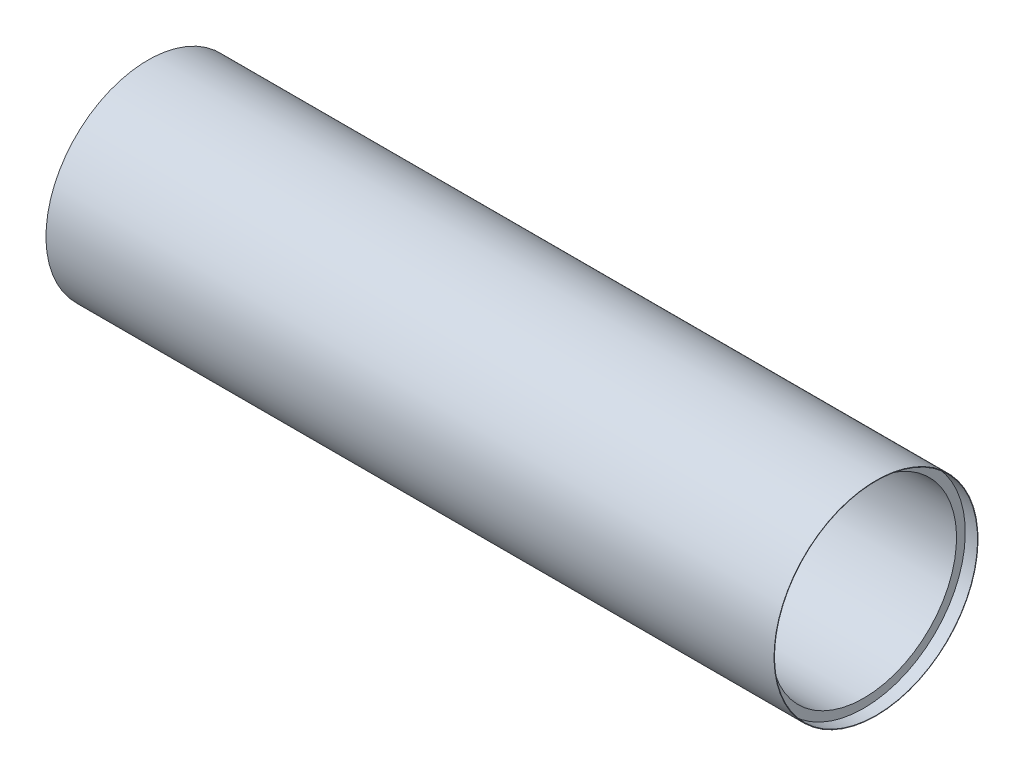
ISO-10303-21;
HEADER;
FILE_DESCRIPTION(('STEP AP214'),'2;1');
FILE_NAME('part.step','',(''),(''),'','','');
FILE_SCHEMA(('AUTOMOTIVE_DESIGN { 1 0 10303 214 1 1 1 1 }'));
ENDSEC;
DATA;
#1=APPLICATION_CONTEXT('core data for automotive mechanical design processes');
#2=APPLICATION_PROTOCOL_DEFINITION('international standard','automotive_design',2000,#1);
#3=PRODUCT_CONTEXT('',#1,'mechanical');
#4=PRODUCT('Part','Part','',(#3));
#5=PRODUCT_RELATED_PRODUCT_CATEGORY('part','',(#4));
#6=PRODUCT_DEFINITION_FORMATION('','',#4);
#7=PRODUCT_DEFINITION_CONTEXT('part definition',#1,'design');
#8=PRODUCT_DEFINITION('design','',#6,#7);
#9=PRODUCT_DEFINITION_SHAPE('','',#8);
#10=(LENGTH_UNIT() NAMED_UNIT(*) SI_UNIT(.MILLI.,.METRE.));
#11=(NAMED_UNIT(*) PLANE_ANGLE_UNIT() SI_UNIT($,.RADIAN.));
#12=(NAMED_UNIT(*) SI_UNIT($,.STERADIAN.) SOLID_ANGLE_UNIT());
#13=UNCERTAINTY_MEASURE_WITH_UNIT(LENGTH_MEASURE(1.E-05),#10,'distance_accuracy_value','');
#14=(GEOMETRIC_REPRESENTATION_CONTEXT(3) GLOBAL_UNCERTAINTY_ASSIGNED_CONTEXT((#13)) GLOBAL_UNIT_ASSIGNED_CONTEXT((#10,
#11,#12)) REPRESENTATION_CONTEXT('',''));
#15=CARTESIAN_POINT('',(0.,0.,0.));
#16=DIRECTION('',(0.,0.,1.));
#17=DIRECTION('',(1.,0.,0.));
#18=AXIS2_PLACEMENT_3D('',#15,#16,#17);
#19=CARTESIAN_POINT('',(0.,0.,0.));
#20=DIRECTION('',(-1.,0.,0.));
#21=DIRECTION('',(0.,-1.,0.));
#22=AXIS2_PLACEMENT_3D('',#19,#20,#21);
#23=CYLINDRICAL_SURFACE('',#22,84.3534);
#24=CARTESIAN_POINT('',(39.146309032124,0.,0.));
#25=DIRECTION('',(-1.,0.,0.));
#26=DIRECTION('',(0.,-1.,0.));
#27=AXIS2_PLACEMENT_3D('',#24,#25,#26);
#28=CIRCLE('',#27,84.3534);
#29=CARTESIAN_POINT('',(39.146309032124,-84.3534,0.));
#30=VERTEX_POINT('',#29);
#31=EDGE_CURVE('E10',#30,#30,#28,.T.);
#32=ORIENTED_EDGE('',*,*,#31,.F.);
#33=EDGE_LOOP('',(#32));
#34=FACE_BOUND('',#33,.T.);
#35=CARTESIAN_POINT('',(641.202509032124,0.,0.));
#36=DIRECTION('',(-1.,0.,0.));
#37=DIRECTION('',(0.,-1.,0.));
#38=AXIS2_PLACEMENT_3D('',#35,#36,#37);
#39=CIRCLE('',#38,84.3534);
#40=CARTESIAN_POINT('',(641.202509032124,-84.3534,0.));
#41=VERTEX_POINT('',#40);
#42=EDGE_CURVE('E60',#41,#41,#39,.T.);
#43=ORIENTED_EDGE('',*,*,#42,.T.);
#44=EDGE_LOOP('',(#43));
#45=FACE_BOUND('',#44,.T.);
#46=ADVANCED_FACE('F32',(#34,#45),#23,.T.);
#47=CARTESIAN_POINT('',(39.146309032124,0.,0.));
#48=DIRECTION('',(1.,0.,0.));
#49=DIRECTION('',(0.,1.,0.));
#50=AXIS2_PLACEMENT_3D('',#47,#48,#49);
#51=PLANE('',#50);
#52=CARTESIAN_POINT('',(39.146309032124,0.,0.));
#53=DIRECTION('',(-1.,0.,0.));
#54=DIRECTION('',(0.,-1.,0.));
#55=AXIS2_PLACEMENT_3D('',#52,#53,#54);
#56=CIRCLE('',#55,83.9724);
#57=CARTESIAN_POINT('',(39.146309032124,-83.9724,0.));
#58=VERTEX_POINT('',#57);
#59=EDGE_CURVE('E38',#58,#58,#56,.T.);
#60=ORIENTED_EDGE('',*,*,#59,.F.);
#61=EDGE_LOOP('',(#60));
#62=FACE_BOUND('',#61,.T.);
#63=ORIENTED_EDGE('',*,*,#31,.T.);
#64=EDGE_LOOP('',(#63));
#65=FACE_BOUND('',#64,.T.);
#66=ADVANCED_FACE('F97',(#62,#65),#51,.F.);
#67=CARTESIAN_POINT('',(0.,0.,0.));
#68=DIRECTION('',(-1.,0.,0.));
#69=DIRECTION('',(0.,-1.,0.));
#70=AXIS2_PLACEMENT_3D('',#67,#68,#69);
#71=CYLINDRICAL_SURFACE('',#70,83.9724);
#72=CARTESIAN_POINT('',(49.306309032124,0.,0.));
#73=DIRECTION('',(-1.,0.,0.));
#74=DIRECTION('',(0.,-1.,0.));
#75=AXIS2_PLACEMENT_3D('',#72,#73,#74);
#76=CIRCLE('',#75,83.9724);
#77=CARTESIAN_POINT('',(49.306309032124,-83.9724,0.));
#78=VERTEX_POINT('',#77);
#79=EDGE_CURVE('E42',#78,#78,#76,.T.);
#80=ORIENTED_EDGE('',*,*,#79,.F.);
#81=EDGE_LOOP('',(#80));
#82=FACE_BOUND('',#81,.T.);
#83=ORIENTED_EDGE('',*,*,#59,.T.);
#84=EDGE_LOOP('',(#83));
#85=FACE_BOUND('',#84,.T.);
#86=ADVANCED_FACE('F92',(#82,#85),#71,.F.);
#87=CARTESIAN_POINT('',(49.306309032124,0.,0.));
#88=DIRECTION('',(1.,0.,0.));
#89=DIRECTION('',(0.,1.,0.));
#90=AXIS2_PLACEMENT_3D('',#87,#88,#89);
#91=PLANE('',#90);
#92=CARTESIAN_POINT('',(49.306309032124,0.,0.));
#93=DIRECTION('',(-1.,0.,0.));
#94=DIRECTION('',(0.,-1.,0.));
#95=AXIS2_PLACEMENT_3D('',#92,#93,#94);
#96=CIRCLE('',#95,76.7334);
#97=CARTESIAN_POINT('',(49.306309032124,-76.7334,0.));
#98=VERTEX_POINT('',#97);
#99=EDGE_CURVE('E46',#98,#98,#96,.T.);
#100=ORIENTED_EDGE('',*,*,#99,.F.);
#101=EDGE_LOOP('',(#100));
#102=FACE_BOUND('',#101,.T.);
#103=ORIENTED_EDGE('',*,*,#79,.T.);
#104=EDGE_LOOP('',(#103));
#105=FACE_BOUND('',#104,.T.);
#106=ADVANCED_FACE('F86',(#102,#105),#91,.F.);
#107=CARTESIAN_POINT('',(0.,0.,0.));
#108=DIRECTION('',(-1.,0.,0.));
#109=DIRECTION('',(0.,-1.,0.));
#110=AXIS2_PLACEMENT_3D('',#107,#108,#109);
#111=CYLINDRICAL_SURFACE('',#110,76.7334);
#112=CARTESIAN_POINT('',(631.042509032124,0.,0.));
#113=DIRECTION('',(-1.,0.,0.));
#114=DIRECTION('',(0.,-1.,0.));
#115=AXIS2_PLACEMENT_3D('',#112,#113,#114);
#116=CIRCLE('',#115,76.7334);
#117=CARTESIAN_POINT('',(631.042509032124,-76.7334,0.));
#118=VERTEX_POINT('',#117);
#119=EDGE_CURVE('E51',#118,#118,#116,.T.);
#120=ORIENTED_EDGE('',*,*,#119,.F.);
#121=EDGE_LOOP('',(#120));
#122=FACE_BOUND('',#121,.T.);
#123=ORIENTED_EDGE('',*,*,#99,.T.);
#124=EDGE_LOOP('',(#123));
#125=FACE_BOUND('',#124,.T.);
#126=ADVANCED_FACE('F80',(#122,#125),#111,.F.);
#127=CARTESIAN_POINT('',(631.042509032124,0.,0.));
#128=DIRECTION('',(-1.,0.,0.));
#129=DIRECTION('',(0.,-1.,0.));
#130=AXIS2_PLACEMENT_3D('',#127,#128,#129);
#131=PLANE('',#130);
#132=CARTESIAN_POINT('',(631.042509032124,0.,0.));
#133=DIRECTION('',(-1.,0.,0.));
#134=DIRECTION('',(0.,-1.,0.));
#135=AXIS2_PLACEMENT_3D('',#132,#133,#134);
#136=CIRCLE('',#135,83.9724);
#137=CARTESIAN_POINT('',(631.042509032124,-83.9724,0.));
#138=VERTEX_POINT('',#137);
#139=EDGE_CURVE('E54',#138,#138,#136,.T.);
#140=ORIENTED_EDGE('',*,*,#139,.F.);
#141=EDGE_LOOP('',(#140));
#142=FACE_BOUND('',#141,.T.);
#143=ORIENTED_EDGE('',*,*,#119,.T.);
#144=EDGE_LOOP('',(#143));
#145=FACE_BOUND('',#144,.T.);
#146=ADVANCED_FACE('F74',(#142,#145),#131,.F.);
#147=CARTESIAN_POINT('',(0.,0.,0.));
#148=DIRECTION('',(-1.,0.,0.));
#149=DIRECTION('',(0.,-1.,0.));
#150=AXIS2_PLACEMENT_3D('',#147,#148,#149);
#151=CYLINDRICAL_SURFACE('',#150,83.9724);
#152=CARTESIAN_POINT('',(641.202509032124,0.,0.));
#153=DIRECTION('',(-1.,0.,0.));
#154=DIRECTION('',(0.,-1.,0.));
#155=AXIS2_PLACEMENT_3D('',#152,#153,#154);
#156=CIRCLE('',#155,83.9724);
#157=CARTESIAN_POINT('',(641.202509032124,-83.9724,0.));
#158=VERTEX_POINT('',#157);
#159=EDGE_CURVE('E57',#158,#158,#156,.T.);
#160=ORIENTED_EDGE('',*,*,#159,.F.);
#161=EDGE_LOOP('',(#160));
#162=FACE_BOUND('',#161,.T.);
#163=ORIENTED_EDGE('',*,*,#139,.T.);
#164=EDGE_LOOP('',(#163));
#165=FACE_BOUND('',#164,.T.);
#166=ADVANCED_FACE('F68',(#162,#165),#151,.F.);
#167=CARTESIAN_POINT('',(641.202509032124,0.,0.));
#168=DIRECTION('',(-1.,0.,0.));
#169=DIRECTION('',(0.,-1.,0.));
#170=AXIS2_PLACEMENT_3D('',#167,#168,#169);
#171=PLANE('',#170);
#172=ORIENTED_EDGE('',*,*,#42,.F.);
#173=EDGE_LOOP('',(#172));
#174=FACE_BOUND('',#173,.T.);
#175=ORIENTED_EDGE('',*,*,#159,.T.);
#176=EDGE_LOOP('',(#175));
#177=FACE_BOUND('',#176,.T.);
#178=ADVANCED_FACE('F65',(#174,#177),#171,.F.);
#179=CLOSED_SHELL('',(#46,#66,#86,#106,#126,#146,#166,#178));
#180=MANIFOLD_SOLID_BREP('B2',#179);
#181=ADVANCED_BREP_SHAPE_REPRESENTATION('',(#18,#180),#14);
#182=SHAPE_DEFINITION_REPRESENTATION(#9,#181);
ENDSEC;
END-ISO-10303-21;
